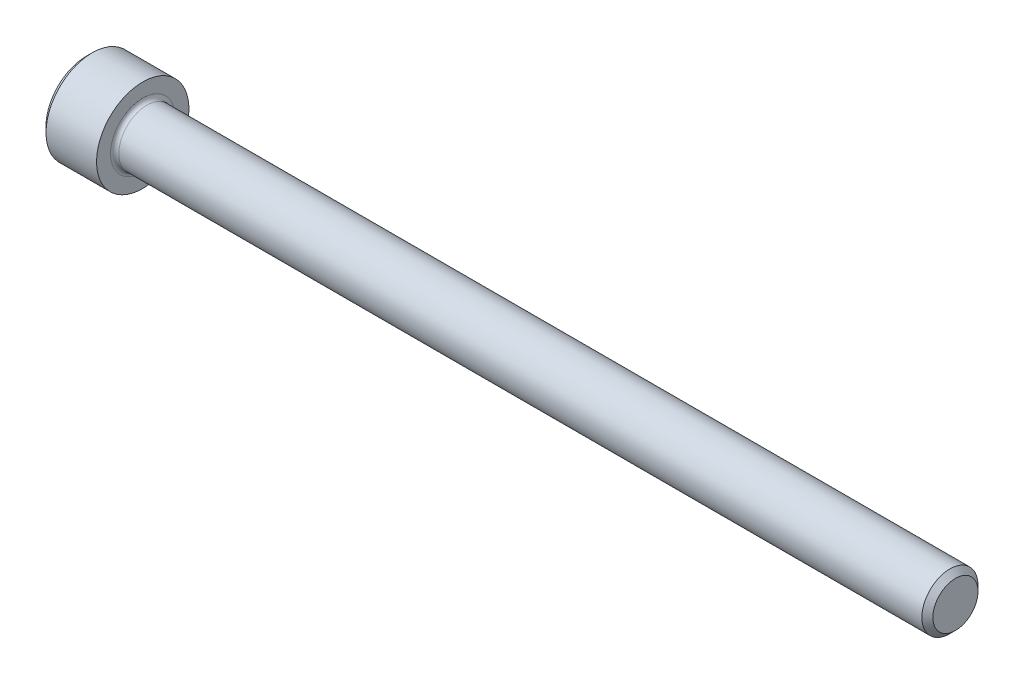
ISO-10303-21;
HEADER;
FILE_DESCRIPTION(('STEP AP214'),'2;1');
FILE_NAME('part.step','',(''),(''),'','','');
FILE_SCHEMA(('AUTOMOTIVE_DESIGN { 1 0 10303 214 1 1 1 1 }'));
ENDSEC;
DATA;
#1=APPLICATION_CONTEXT('core data for automotive mechanical design processes');
#2=APPLICATION_PROTOCOL_DEFINITION('international standard','automotive_design',2000,#1);
#3=PRODUCT_CONTEXT('',#1,'mechanical');
#4=PRODUCT('Part','Part','',(#3));
#5=PRODUCT_RELATED_PRODUCT_CATEGORY('part','',(#4));
#6=PRODUCT_DEFINITION_FORMATION('','',#4);
#7=PRODUCT_DEFINITION_CONTEXT('part definition',#1,'design');
#8=PRODUCT_DEFINITION('design','',#6,#7);
#9=PRODUCT_DEFINITION_SHAPE('','',#8);
#10=(LENGTH_UNIT() NAMED_UNIT(*) SI_UNIT(.MILLI.,.METRE.));
#11=(NAMED_UNIT(*) PLANE_ANGLE_UNIT() SI_UNIT($,.RADIAN.));
#12=(NAMED_UNIT(*) SI_UNIT($,.STERADIAN.) SOLID_ANGLE_UNIT());
#13=UNCERTAINTY_MEASURE_WITH_UNIT(LENGTH_MEASURE(1.E-05),#10,'distance_accuracy_value','');
#14=(GEOMETRIC_REPRESENTATION_CONTEXT(3) GLOBAL_UNCERTAINTY_ASSIGNED_CONTEXT((#13)) GLOBAL_UNIT_ASSIGNED_CONTEXT((#10,
#11,#12)) REPRESENTATION_CONTEXT('',''));
#15=CARTESIAN_POINT('',(0.,0.,0.));
#16=DIRECTION('',(0.,0.,1.));
#17=DIRECTION('',(1.,0.,0.));
#18=AXIS2_PLACEMENT_3D('',#15,#16,#17);
#19=CARTESIAN_POINT('',(2.286,1.14604605784411,1.98501));
#20=DIRECTION('',(-1.,0.,0.));
#21=DIRECTION('',(0.,0.,1.));
#22=AXIS2_PLACEMENT_3D('',#19,#20,#21);
#23=PLANE('',#22);
#24=DIRECTION('',(0.,0.500000000000001,0.866025403784438));
#25=VECTOR('',#24,1.);
#26=CARTESIAN_POINT('',(2.286,-1.71906908676614,0.992505));
#27=LINE('',#26,#25);
#28=CARTESIAN_POINT('',(2.2859999999804,-1.71906908679011,0.992505000013839));
#29=VERTEX_POINT('',#28);
#30=CARTESIAN_POINT('',(2.286,-1.14604605784409,1.98501));
#31=VERTEX_POINT('',#30);
#32=EDGE_CURVE('E91',#29,#31,#27,.T.);
#33=ORIENTED_EDGE('',*,*,#32,.T.);
#34=DIRECTION('',(0.,1.,0.));
#35=VECTOR('',#34,1.);
#36=CARTESIAN_POINT('',(2.286,1.14604605784411,1.98501));
#37=LINE('',#36,#35);
#38=CARTESIAN_POINT('',(2.2859999999804,0.,1.98501000002768));
#39=VERTEX_POINT('',#38);
#40=EDGE_CURVE('E87',#31,#39,#37,.T.);
#41=ORIENTED_EDGE('',*,*,#40,.T.);
#42=CARTESIAN_POINT('',(2.2859999999608,0.,0.));
#43=DIRECTION('',(-1.,0.,0.));
#44=DIRECTION('',(0.,0.,1.));
#45=AXIS2_PLACEMENT_3D('',#42,#43,#44);
#46=CIRCLE('',#45,1.98501000005535);
#47=EDGE_CURVE('E19',#39,#29,#46,.F.);
#48=ORIENTED_EDGE('',*,*,#47,.T.);
#49=EDGE_LOOP('',(#33,#41,#48));
#50=FACE_BOUND('',#49,.T.);
#51=ADVANCED_FACE('F16',(#50),#23,.T.);
#52=CARTESIAN_POINT('',(2.286,1.14604605784411,1.98501));
#53=DIRECTION('',(-1.,0.,0.));
#54=DIRECTION('',(0.,0.,1.));
#55=AXIS2_PLACEMENT_3D('',#52,#53,#54);
#56=PLANE('',#55);
#57=DIRECTION('',(0.,-0.499999999999998,0.86602540378444));
#58=VECTOR('',#57,1.);
#59=CARTESIAN_POINT('',(2.286,-1.71906908676615,-0.992504999999996));
#60=LINE('',#59,#58);
#61=CARTESIAN_POINT('',(2.2859999999804,-1.71906908679012,-0.992505000013836));
#62=VERTEX_POINT('',#61);
#63=CARTESIAN_POINT('',(2.286,-2.29209211568819,0.));
#64=VERTEX_POINT('',#63);
#65=EDGE_CURVE('E95',#62,#64,#60,.T.);
#66=ORIENTED_EDGE('',*,*,#65,.T.);
#67=DIRECTION('',(0.,0.500000000000001,0.866025403784438));
#68=VECTOR('',#67,1.);
#69=CARTESIAN_POINT('',(2.286,-2.29209211568819,0.));
#70=LINE('',#69,#68);
#71=EDGE_CURVE('E161',#64,#29,#70,.T.);
#72=ORIENTED_EDGE('',*,*,#71,.T.);
#73=CARTESIAN_POINT('',(2.2859999999608,0.,0.));
#74=DIRECTION('',(-1.,0.,0.));
#75=DIRECTION('',(0.,0.,1.));
#76=AXIS2_PLACEMENT_3D('',#73,#74,#75);
#77=CIRCLE('',#76,1.98501000005535);
#78=EDGE_CURVE('E107',#29,#62,#77,.F.);
#79=ORIENTED_EDGE('',*,*,#78,.T.);
#80=EDGE_LOOP('',(#66,#72,#79));
#81=FACE_BOUND('',#80,.T.);
#82=ADVANCED_FACE('F216',(#81),#56,.T.);
#83=CARTESIAN_POINT('',(2.286,1.14604605784411,1.98501));
#84=DIRECTION('',(-1.,0.,0.));
#85=DIRECTION('',(0.,0.,1.));
#86=AXIS2_PLACEMENT_3D('',#83,#84,#85);
#87=PLANE('',#86);
#88=DIRECTION('',(0.,1.,0.));
#89=VECTOR('',#88,1.);
#90=CARTESIAN_POINT('',(2.286,1.14604605784411,-1.98501));
#91=LINE('',#90,#89);
#92=CARTESIAN_POINT('',(2.2859999999804,0.,-1.98501000002768));
#93=VERTEX_POINT('',#92);
#94=CARTESIAN_POINT('',(2.286,-1.1460460578441,-1.98501));
#95=VERTEX_POINT('',#94);
#96=EDGE_CURVE('E156',#93,#95,#91,.F.);
#97=ORIENTED_EDGE('',*,*,#96,.T.);
#98=DIRECTION('',(0.,-0.499999999999999,0.866025403784439));
#99=VECTOR('',#98,1.);
#100=CARTESIAN_POINT('',(2.286,-1.1460460578441,-1.98501));
#101=LINE('',#100,#99);
#102=EDGE_CURVE('E151',#95,#62,#101,.T.);
#103=ORIENTED_EDGE('',*,*,#102,.T.);
#104=CARTESIAN_POINT('',(2.2859999999608,0.,0.));
#105=DIRECTION('',(-1.,0.,0.));
#106=DIRECTION('',(0.,0.,1.));
#107=AXIS2_PLACEMENT_3D('',#104,#105,#106);
#108=CIRCLE('',#107,1.98501000005535);
#109=EDGE_CURVE('E213',#62,#93,#108,.F.);
#110=ORIENTED_EDGE('',*,*,#109,.T.);
#111=EDGE_LOOP('',(#97,#103,#110));
#112=FACE_BOUND('',#111,.T.);
#113=ADVANCED_FACE('F218',(#112),#87,.T.);
#114=CARTESIAN_POINT('',(2.286,1.14604605784411,1.98501));
#115=DIRECTION('',(-1.,0.,0.));
#116=DIRECTION('',(0.,0.,1.));
#117=AXIS2_PLACEMENT_3D('',#114,#115,#116);
#118=PLANE('',#117);
#119=DIRECTION('',(0.,-0.500000000000001,-0.866025403784438));
#120=VECTOR('',#119,1.);
#121=CARTESIAN_POINT('',(2.286,1.71906908676615,-0.992505000000006));
#122=LINE('',#121,#120);
#123=CARTESIAN_POINT('',(2.2859999999804,1.71906908679012,-0.992505000013843));
#124=VERTEX_POINT('',#123);
#125=CARTESIAN_POINT('',(2.286,1.1460460578441,-1.98501));
#126=VERTEX_POINT('',#125);
#127=EDGE_CURVE('E146',#124,#126,#122,.T.);
#128=ORIENTED_EDGE('',*,*,#127,.T.);
#129=DIRECTION('',(0.,1.,0.));
#130=VECTOR('',#129,1.);
#131=CARTESIAN_POINT('',(2.286,1.14604605784411,-1.98501));
#132=LINE('',#131,#130);
#133=EDGE_CURVE('E141',#126,#93,#132,.F.);
#134=ORIENTED_EDGE('',*,*,#133,.T.);
#135=CARTESIAN_POINT('',(2.2859999999608,0.,0.));
#136=DIRECTION('',(-1.,0.,0.));
#137=DIRECTION('',(0.,0.,1.));
#138=AXIS2_PLACEMENT_3D('',#135,#136,#137);
#139=CIRCLE('',#138,1.98501000005535);
#140=EDGE_CURVE('E210',#93,#124,#139,.F.);
#141=ORIENTED_EDGE('',*,*,#140,.T.);
#142=EDGE_LOOP('',(#128,#134,#141));
#143=FACE_BOUND('',#142,.T.);
#144=ADVANCED_FACE('F223',(#143),#118,.T.);
#145=CARTESIAN_POINT('',(2.286,1.14604605784411,1.98501));
#146=DIRECTION('',(-1.,0.,0.));
#147=DIRECTION('',(0.,0.,1.));
#148=AXIS2_PLACEMENT_3D('',#145,#146,#147);
#149=PLANE('',#148);
#150=DIRECTION('',(0.,0.500000000000002,-0.866025403784437));
#151=VECTOR('',#150,1.);
#152=CARTESIAN_POINT('',(2.286,1.71906908676615,0.992504999999996));
#153=LINE('',#152,#151);
#154=CARTESIAN_POINT('',(2.2859999999804,1.71906908679012,0.992505000013835));
#155=VERTEX_POINT('',#154);
#156=CARTESIAN_POINT('',(2.286,2.2920921156882,0.));
#157=VERTEX_POINT('',#156);
#158=EDGE_CURVE('E136',#155,#157,#153,.T.);
#159=ORIENTED_EDGE('',*,*,#158,.T.);
#160=DIRECTION('',(0.,-0.500000000000002,-0.866025403784437));
#161=VECTOR('',#160,1.);
#162=CARTESIAN_POINT('',(2.286,2.2920921156882,0.));
#163=LINE('',#162,#161);
#164=EDGE_CURVE('E108',#157,#124,#163,.T.);
#165=ORIENTED_EDGE('',*,*,#164,.T.);
#166=CARTESIAN_POINT('',(2.2859999999608,0.,0.));
#167=DIRECTION('',(-1.,0.,0.));
#168=DIRECTION('',(0.,0.,1.));
#169=AXIS2_PLACEMENT_3D('',#166,#167,#168);
#170=CIRCLE('',#169,1.98501000005535);
#171=EDGE_CURVE('E114',#124,#155,#170,.F.);
#172=ORIENTED_EDGE('',*,*,#171,.T.);
#173=EDGE_LOOP('',(#159,#165,#172));
#174=FACE_BOUND('',#173,.T.);
#175=ADVANCED_FACE('F225',(#174),#149,.T.);
#176=CARTESIAN_POINT('',(2.28600000002643,0.,0.));
#177=DIRECTION('',(-1.,0.,0.));
#178=DIRECTION('',(0.,0.,1.));
#179=AXIS2_PLACEMENT_3D('',#176,#177,#178);
#180=CONICAL_SURFACE('',#179,1.98500999994167,1.04719755112655);
#181=CARTESIAN_POINT('',(3.43204605786696,0.,-5.6843418860808E-11));
#182=VERTEX_POINT('',#181);
#183=VERTEX_LOOP('',#182);
#184=FACE_BOUND('',#183,.T.);
#185=ORIENTED_EDGE('',*,*,#171,.F.);
#186=ORIENTED_EDGE('',*,*,#140,.F.);
#187=ORIENTED_EDGE('',*,*,#109,.F.);
#188=ORIENTED_EDGE('',*,*,#78,.F.);
#189=ORIENTED_EDGE('',*,*,#47,.F.);
#190=CARTESIAN_POINT('',(2.2859999999608,0.,0.));
#191=DIRECTION('',(-1.,0.,0.));
#192=DIRECTION('',(0.,0.,1.));
#193=AXIS2_PLACEMENT_3D('',#190,#191,#192);
#194=CIRCLE('',#193,1.98501000005535);
#195=EDGE_CURVE('E103',#155,#39,#194,.F.);
#196=ORIENTED_EDGE('',*,*,#195,.F.);
#197=EDGE_LOOP('',(#185,#186,#187,#188,#189,#196));
#198=FACE_BOUND('',#197,.T.);
#199=ADVANCED_FACE('F102',(#184,#198),#180,.F.);
#200=CARTESIAN_POINT('',(2.286,1.14604605784411,1.98501));
#201=DIRECTION('',(-1.,0.,0.));
#202=DIRECTION('',(0.,0.,1.));
#203=AXIS2_PLACEMENT_3D('',#200,#201,#202);
#204=PLANE('',#203);
#205=DIRECTION('',(0.,-1.,0.));
#206=VECTOR('',#205,1.);
#207=CARTESIAN_POINT('',(2.286,-1.14604605784409,1.98501));
#208=LINE('',#207,#206);
#209=CARTESIAN_POINT('',(2.286,1.14604605784411,1.98501));
#210=VERTEX_POINT('',#209);
#211=EDGE_CURVE('E111',#39,#210,#208,.F.);
#212=ORIENTED_EDGE('',*,*,#211,.T.);
#213=DIRECTION('',(0.,0.499999999999998,-0.86602540378444));
#214=VECTOR('',#213,1.);
#215=CARTESIAN_POINT('',(2.286,2.2920921156882,0.));
#216=LINE('',#215,#214);
#217=EDGE_CURVE('E113',#155,#210,#216,.F.);
#218=ORIENTED_EDGE('',*,*,#217,.F.);
#219=ORIENTED_EDGE('',*,*,#195,.T.);
#220=EDGE_LOOP('',(#212,#218,#219));
#221=FACE_BOUND('',#220,.T.);
#222=ADVANCED_FACE('F110',(#221),#204,.T.);
#223=CARTESIAN_POINT('',(2.286,2.2920921156882,0.));
#224=DIRECTION('',(0.,-0.86602540378444,-0.499999999999998));
#225=DIRECTION('',(0.,0.499999999999998,-0.86602540378444));
#226=AXIS2_PLACEMENT_3D('',#223,#224,#225);
#227=PLANE('',#226);
#228=ORIENTED_EDGE('',*,*,#217,.T.);
#229=DIRECTION('',(1.,0.,0.));
#230=VECTOR('',#229,1.);
#231=CARTESIAN_POINT('',(2.286,1.14604605784411,1.98501));
#232=LINE('',#231,#230);
#233=CARTESIAN_POINT('',(0.,1.14604605784411,1.98501));
#234=VERTEX_POINT('',#233);
#235=EDGE_CURVE('E119',#210,#234,#232,.F.);
#236=ORIENTED_EDGE('',*,*,#235,.T.);
#237=DIRECTION('',(0.,-0.499999999999998,0.86602540378444));
#238=VECTOR('',#237,1.);
#239=CARTESIAN_POINT('',(0.,2.2920921156882,0.));
#240=LINE('',#239,#238);
#241=CARTESIAN_POINT('',(0.,2.2920921156882,0.));
#242=VERTEX_POINT('',#241);
#243=EDGE_CURVE('E126',#242,#234,#240,.T.);
#244=ORIENTED_EDGE('',*,*,#243,.F.);
#245=DIRECTION('',(1.,0.,0.));
#246=VECTOR('',#245,1.);
#247=CARTESIAN_POINT('',(2.286,2.2920921156882,0.));
#248=LINE('',#247,#246);
#249=EDGE_CURVE('E176',#242,#157,#248,.T.);
#250=ORIENTED_EDGE('',*,*,#249,.T.);
#251=ORIENTED_EDGE('',*,*,#158,.F.);
#252=EDGE_LOOP('',(#228,#236,#244,#250,#251));
#253=FACE_BOUND('',#252,.T.);
#254=ADVANCED_FACE('F231',(#253),#227,.T.);
#255=CARTESIAN_POINT('',(2.286,-1.14604605784409,1.98501));
#256=DIRECTION('',(0.,0.,1.));
#257=DIRECTION('',(0.,-1.,0.));
#258=AXIS2_PLACEMENT_3D('',#255,#256,#257);
#259=PLANE('',#258);
#260=ORIENTED_EDGE('',*,*,#235,.F.);
#261=ORIENTED_EDGE('',*,*,#211,.F.);
#262=ORIENTED_EDGE('',*,*,#40,.F.);
#263=DIRECTION('',(1.,0.,0.));
#264=VECTOR('',#263,1.);
#265=CARTESIAN_POINT('',(2.286,-1.14604605784409,1.98501));
#266=LINE('',#265,#264);
#267=CARTESIAN_POINT('',(0.,-1.14604605784409,1.98501));
#268=VERTEX_POINT('',#267);
#269=EDGE_CURVE('E121',#268,#31,#266,.T.);
#270=ORIENTED_EDGE('',*,*,#269,.F.);
#271=DIRECTION('',(0.,1.,0.));
#272=VECTOR('',#271,1.);
#273=CARTESIAN_POINT('',(0.,0.,1.98501));
#274=LINE('',#273,#272);
#275=EDGE_CURVE('E235',#234,#268,#274,.F.);
#276=ORIENTED_EDGE('',*,*,#275,.F.);
#277=EDGE_LOOP('',(#260,#261,#262,#270,#276));
#278=FACE_BOUND('',#277,.T.);
#279=ADVANCED_FACE('F117',(#278),#259,.F.);
#280=CARTESIAN_POINT('',(2.286,-1.14604605784409,1.98501));
#281=DIRECTION('',(0.,0.866025403784438,-0.500000000000001));
#282=DIRECTION('',(0.,0.500000000000001,0.866025403784438));
#283=AXIS2_PLACEMENT_3D('',#280,#281,#282);
#284=PLANE('',#283);
#285=ORIENTED_EDGE('',*,*,#71,.F.);
#286=DIRECTION('',(1.,0.,0.));
#287=VECTOR('',#286,1.);
#288=CARTESIAN_POINT('',(2.286,-2.29209211568819,0.));
#289=LINE('',#288,#287);
#290=CARTESIAN_POINT('',(0.,-2.29209211568819,0.));
#291=VERTEX_POINT('',#290);
#292=EDGE_CURVE('E186',#291,#64,#289,.T.);
#293=ORIENTED_EDGE('',*,*,#292,.F.);
#294=DIRECTION('',(0.,-0.500000000000001,-0.866025403784438));
#295=VECTOR('',#294,1.);
#296=CARTESIAN_POINT('',(0.,-1.14604605784409,1.98501));
#297=LINE('',#296,#295);
#298=EDGE_CURVE('E236',#268,#291,#297,.T.);
#299=ORIENTED_EDGE('',*,*,#298,.F.);
#300=ORIENTED_EDGE('',*,*,#269,.T.);
#301=ORIENTED_EDGE('',*,*,#32,.F.);
#302=EDGE_LOOP('',(#285,#293,#299,#300,#301));
#303=FACE_BOUND('',#302,.T.);
#304=ADVANCED_FACE('F312',(#303),#284,.T.);
#305=CARTESIAN_POINT('',(2.286,-2.29209211568819,0.));
#306=DIRECTION('',(0.,0.866025403784439,0.499999999999999));
#307=DIRECTION('',(0.,-0.499999999999999,0.866025403784439));
#308=AXIS2_PLACEMENT_3D('',#305,#306,#307);
#309=PLANE('',#308);
#310=ORIENTED_EDGE('',*,*,#102,.F.);
#311=DIRECTION('',(1.,0.,0.));
#312=VECTOR('',#311,1.);
#313=CARTESIAN_POINT('',(2.286,-1.1460460578441,-1.98501));
#314=LINE('',#313,#312);
#315=CARTESIAN_POINT('',(0.,-1.1460460578441,-1.98501));
#316=VERTEX_POINT('',#315);
#317=EDGE_CURVE('E179',#95,#316,#314,.F.);
#318=ORIENTED_EDGE('',*,*,#317,.T.);
#319=DIRECTION('',(0.,0.499999999999999,-0.86602540378444));
#320=VECTOR('',#319,1.);
#321=CARTESIAN_POINT('',(0.,-2.29209211568819,0.));
#322=LINE('',#321,#320);
#323=EDGE_CURVE('E238',#291,#316,#322,.T.);
#324=ORIENTED_EDGE('',*,*,#323,.F.);
#325=ORIENTED_EDGE('',*,*,#292,.T.);
#326=ORIENTED_EDGE('',*,*,#65,.F.);
#327=EDGE_LOOP('',(#310,#318,#324,#325,#326));
#328=FACE_BOUND('',#327,.T.);
#329=ADVANCED_FACE('F309',(#328),#309,.T.);
#330=CARTESIAN_POINT('',(2.286,1.1460460578441,-1.98501));
#331=DIRECTION('',(0.,0.,-1.));
#332=DIRECTION('',(0.,1.,0.));
#333=AXIS2_PLACEMENT_3D('',#330,#331,#332);
#334=PLANE('',#333);
#335=ORIENTED_EDGE('',*,*,#317,.F.);
#336=ORIENTED_EDGE('',*,*,#96,.F.);
#337=ORIENTED_EDGE('',*,*,#133,.F.);
#338=DIRECTION('',(1.,0.,0.));
#339=VECTOR('',#338,1.);
#340=CARTESIAN_POINT('',(2.286,1.1460460578441,-1.98501));
#341=LINE('',#340,#339);
#342=CARTESIAN_POINT('',(0.,1.1460460578441,-1.98501));
#343=VERTEX_POINT('',#342);
#344=EDGE_CURVE('E34',#126,#343,#341,.F.);
#345=ORIENTED_EDGE('',*,*,#344,.T.);
#346=DIRECTION('',(0.,1.,0.));
#347=VECTOR('',#346,1.);
#348=CARTESIAN_POINT('',(0.,0.,-1.98501));
#349=LINE('',#348,#347);
#350=EDGE_CURVE('E243',#316,#343,#349,.T.);
#351=ORIENTED_EDGE('',*,*,#350,.F.);
#352=EDGE_LOOP('',(#335,#336,#337,#345,#351));
#353=FACE_BOUND('',#352,.T.);
#354=ADVANCED_FACE('F306',(#353),#334,.F.);
#355=CARTESIAN_POINT('',(2.286,2.2920921156882,0.));
#356=DIRECTION('',(0.,0.866025403784438,-0.500000000000002));
#357=DIRECTION('',(0.,0.500000000000002,0.866025403784438));
#358=AXIS2_PLACEMENT_3D('',#355,#356,#357);
#359=PLANE('',#358);
#360=ORIENTED_EDGE('',*,*,#344,.F.);
#361=ORIENTED_EDGE('',*,*,#127,.F.);
#362=ORIENTED_EDGE('',*,*,#164,.F.);
#363=ORIENTED_EDGE('',*,*,#249,.F.);
#364=DIRECTION('',(0.,0.500000000000002,0.866025403784438));
#365=VECTOR('',#364,1.);
#366=CARTESIAN_POINT('',(0.,1.1460460578441,-1.98501));
#367=LINE('',#366,#365);
#368=EDGE_CURVE('E206',#343,#242,#367,.T.);
#369=ORIENTED_EDGE('',*,*,#368,.F.);
#370=EDGE_LOOP('',(#360,#361,#362,#363,#369));
#371=FACE_BOUND('',#370,.T.);
#372=ADVANCED_FACE('F228',(#371),#359,.F.);
#373=CARTESIAN_POINT('',(0.,0.,0.));
#374=DIRECTION('',(-1.,0.,0.));
#375=DIRECTION('',(0.,0.,1.));
#376=AXIS2_PLACEMENT_3D('',#373,#374,#375);
#377=PLANE('',#376);
#378=CARTESIAN_POINT('',(0.,0.,0.));
#379=DIRECTION('',(1.,0.,0.));
#380=DIRECTION('',(0.,1.,0.));
#381=AXIS2_PLACEMENT_3D('',#378,#379,#380);
#382=CIRCLE('',#381,3.48615000007158);
#383=CARTESIAN_POINT('',(0.,3.48615000007158,0.));
#384=VERTEX_POINT('',#383);
#385=EDGE_CURVE('E204',#384,#384,#382,.T.);
#386=ORIENTED_EDGE('',*,*,#385,.F.);
#387=EDGE_LOOP('',(#386));
#388=FACE_BOUND('',#387,.T.);
#389=ORIENTED_EDGE('',*,*,#350,.T.);
#390=ORIENTED_EDGE('',*,*,#368,.T.);
#391=ORIENTED_EDGE('',*,*,#243,.T.);
#392=ORIENTED_EDGE('',*,*,#275,.T.);
#393=ORIENTED_EDGE('',*,*,#298,.T.);
#394=ORIENTED_EDGE('',*,*,#323,.T.);
#395=EDGE_LOOP('',(#389,#390,#391,#392,#393,#394));
#396=FACE_BOUND('',#395,.T.);
#397=ADVANCED_FACE('F299',(#388,#396),#377,.T.);
#398=CARTESIAN_POINT('',(0.482599999998001,0.,0.));
#399=DIRECTION('',(1.,0.,0.));
#400=DIRECTION('',(0.,1.,0.));
#401=AXIS2_PLACEMENT_3D('',#398,#399,#400);
#402=CONICAL_SURFACE('',#401,3.96875000001273,0.785398163338555);
#403=ORIENTED_EDGE('',*,*,#385,.T.);
#404=EDGE_LOOP('',(#403));
#405=FACE_BOUND('',#404,.T.);
#406=CARTESIAN_POINT('',(0.4826,0.,0.));
#407=DIRECTION('',(-1.,0.,0.));
#408=DIRECTION('',(0.,0.,1.));
#409=AXIS2_PLACEMENT_3D('',#406,#407,#408);
#410=CIRCLE('',#409,3.96875);
#411=CARTESIAN_POINT('',(0.4826,0.,3.96875));
#412=VERTEX_POINT('',#411);
#413=EDGE_CURVE('E203',#412,#412,#410,.F.);
#414=ORIENTED_EDGE('',*,*,#413,.F.);
#415=EDGE_LOOP('',(#414));
#416=FACE_BOUND('',#415,.T.);
#417=ADVANCED_FACE('F295',(#405,#416),#402,.T.);
#418=CARTESIAN_POINT('',(-31.75,0.,0.));
#419=DIRECTION('',(-1.,0.,0.));
#420=DIRECTION('',(0.,0.,1.));
#421=AXIS2_PLACEMENT_3D('',#418,#419,#420);
#422=CYLINDRICAL_SURFACE('',#421,3.96875);
#423=ORIENTED_EDGE('',*,*,#413,.T.);
#424=EDGE_LOOP('',(#423));
#425=FACE_BOUND('',#424,.T.);
#426=CARTESIAN_POINT('',(4.826,0.,0.));
#427=DIRECTION('',(-1.,0.,0.));
#428=DIRECTION('',(0.,0.,1.));
#429=AXIS2_PLACEMENT_3D('',#426,#427,#428);
#430=CIRCLE('',#429,3.96875);
#431=CARTESIAN_POINT('',(4.826,0.,3.96875));
#432=VERTEX_POINT('',#431);
#433=EDGE_CURVE('E200',#432,#432,#430,.F.);
#434=ORIENTED_EDGE('',*,*,#433,.F.);
#435=EDGE_LOOP('',(#434));
#436=FACE_BOUND('',#435,.T.);
#437=ADVANCED_FACE('F291',(#425,#436),#422,.T.);
#438=CARTESIAN_POINT('',(4.826,3.96875,0.));
#439=DIRECTION('',(1.,0.,0.));
#440=DIRECTION('',(0.,0.,-1.));
#441=AXIS2_PLACEMENT_3D('',#438,#439,#440);
#442=PLANE('',#441);
#443=ORIENTED_EDGE('',*,*,#433,.T.);
#444=EDGE_LOOP('',(#443));
#445=FACE_BOUND('',#444,.T.);
#446=CARTESIAN_POINT('',(4.826,0.,0.));
#447=DIRECTION('',(1.,0.,0.));
#448=DIRECTION('',(0.,0.,-1.));
#449=AXIS2_PLACEMENT_3D('',#446,#447,#448);
#450=CIRCLE('',#449,2.7686);
#451=CARTESIAN_POINT('',(4.826,0.,-2.7686));
#452=VERTEX_POINT('',#451);
#453=EDGE_CURVE('E199',#452,#452,#450,.F.);
#454=ORIENTED_EDGE('',*,*,#453,.T.);
#455=EDGE_LOOP('',(#454));
#456=FACE_BOUND('',#455,.T.);
#457=ADVANCED_FACE('F282',(#445,#456),#442,.T.);
#458=CARTESIAN_POINT('',(74.676,1.94056,0.));
#459=DIRECTION('',(1.,0.,0.));
#460=DIRECTION('',(0.,0.,-1.));
#461=AXIS2_PLACEMENT_3D('',#458,#459,#460);
#462=PLANE('',#461);
#463=CARTESIAN_POINT('',(74.6760000000677,0.,0.));
#464=DIRECTION('',(-1.,0.,0.));
#465=DIRECTION('',(0.,0.,1.));
#466=AXIS2_PLACEMENT_3D('',#463,#464,#465);
#467=CIRCLE('',#466,1.94056000003684);
#468=CARTESIAN_POINT('',(74.6760000000677,0.,1.94056000003684));
#469=VERTEX_POINT('',#468);
#470=EDGE_CURVE('E196',#469,#469,#467,.T.);
#471=ORIENTED_EDGE('',*,*,#470,.F.);
#472=EDGE_LOOP('',(#471));
#473=FACE_BOUND('',#472,.T.);
#474=ADVANCED_FACE('F269',(#473),#462,.T.);
#475=CARTESIAN_POINT('',(5.1816,0.,0.));
#476=DIRECTION('',(1.,0.,0.));
#477=DIRECTION('',(0.,0.,-1.));
#478=AXIS2_PLACEMENT_3D('',#475,#476,#477);
#479=TOROIDAL_SURFACE('',#478,2.7686,0.3556);
#480=ORIENTED_EDGE('',*,*,#453,.F.);
#481=EDGE_LOOP('',(#480));
#482=FACE_BOUND('',#481,.T.);
#483=CARTESIAN_POINT('',(5.1816,0.,0.));
#484=DIRECTION('',(-1.,0.,0.));
#485=DIRECTION('',(0.,0.,1.));
#486=AXIS2_PLACEMENT_3D('',#483,#484,#485);
#487=CIRCLE('',#486,2.413);
#488=CARTESIAN_POINT('',(5.1816,0.,2.413));
#489=VERTEX_POINT('',#488);
#490=EDGE_CURVE('E25',#489,#489,#487,.F.);
#491=ORIENTED_EDGE('',*,*,#490,.F.);
#492=EDGE_LOOP('',(#491));
#493=FACE_BOUND('',#492,.T.);
#494=ADVANCED_FACE('F257',(#482,#493),#479,.F.);
#495=CARTESIAN_POINT('',(74.2035600000577,0.,0.));
#496=DIRECTION('',(-1.,0.,0.));
#497=DIRECTION('',(0.,0.,1.));
#498=AXIS2_PLACEMENT_3D('',#495,#496,#497);
#499=CONICAL_SURFACE('',#498,2.41299999999001,0.785398163337289);
#500=ORIENTED_EDGE('',*,*,#470,.T.);
#501=EDGE_LOOP('',(#500));
#502=FACE_BOUND('',#501,.T.);
#503=CARTESIAN_POINT('',(74.20356,0.,0.));
#504=DIRECTION('',(-1.,0.,0.));
#505=DIRECTION('',(0.,0.,1.));
#506=AXIS2_PLACEMENT_3D('',#503,#504,#505);
#507=CIRCLE('',#506,2.413);
#508=CARTESIAN_POINT('',(74.20356,0.,2.413));
#509=VERTEX_POINT('',#508);
#510=EDGE_CURVE('E11',#509,#509,#507,.T.);
#511=ORIENTED_EDGE('',*,*,#510,.F.);
#512=EDGE_LOOP('',(#511));
#513=FACE_BOUND('',#512,.T.);
#514=ADVANCED_FACE('F268',(#502,#513),#499,.T.);
#515=CARTESIAN_POINT('',(-31.75,0.,0.));
#516=DIRECTION('',(-1.,0.,0.));
#517=DIRECTION('',(0.,0.,1.));
#518=AXIS2_PLACEMENT_3D('',#515,#516,#517);
#519=CYLINDRICAL_SURFACE('',#518,2.413);
#520=ORIENTED_EDGE('',*,*,#510,.T.);
#521=EDGE_LOOP('',(#520));
#522=FACE_BOUND('',#521,.T.);
#523=ORIENTED_EDGE('',*,*,#490,.T.);
#524=EDGE_LOOP('',(#523));
#525=FACE_BOUND('',#524,.T.);
#526=ADVANCED_FACE('F336',(#522,#525),#519,.T.);
#527=CLOSED_SHELL('',(#51,#82,#113,#144,#175,#199,#222,#254,#279,#304,#329,#354,#372,#397,#417,
#437,#457,#474,#494,#514,#526));
#528=MANIFOLD_SOLID_BREP('B1',#527);
#529=ADVANCED_BREP_SHAPE_REPRESENTATION('',(#18,#528),#14);
#530=SHAPE_DEFINITION_REPRESENTATION(#9,#529);
ENDSEC;
END-ISO-10303-21;
